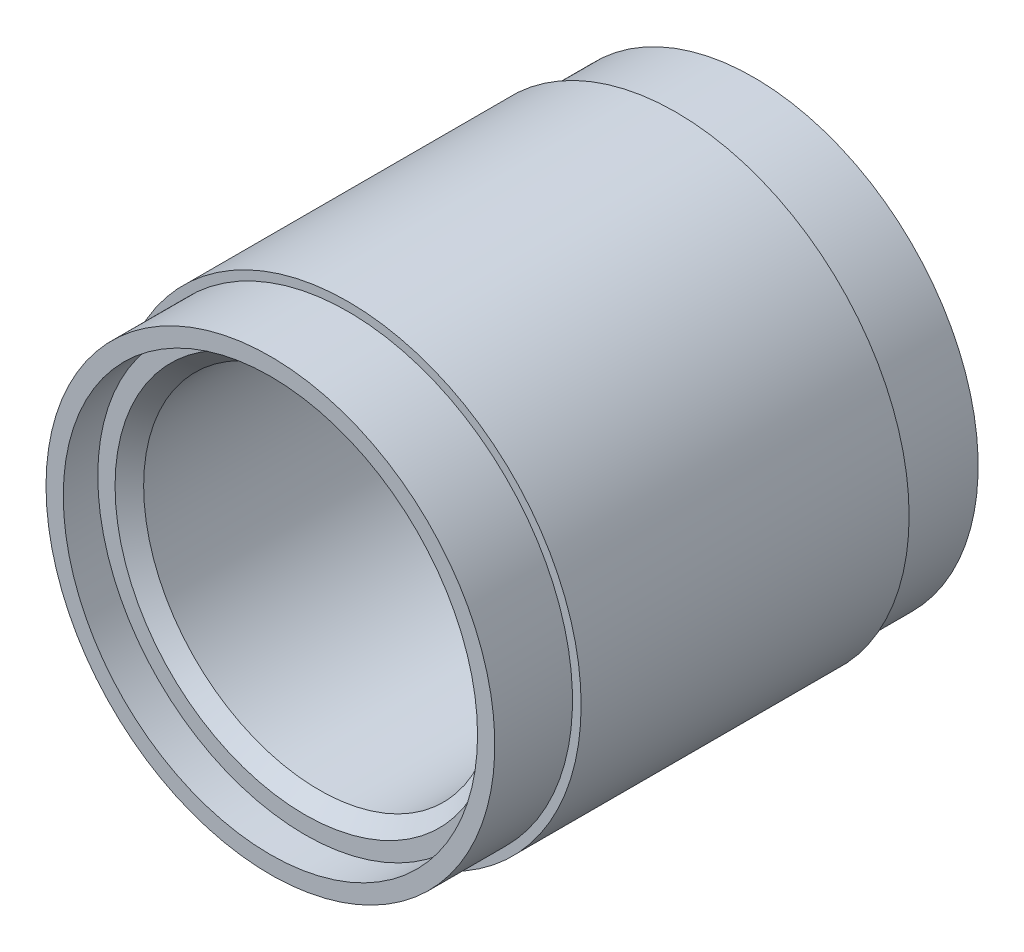
ISO-10303-21;
HEADER;
FILE_DESCRIPTION(('STEP AP214'),'2;1');
FILE_NAME('part.step','',(''),(''),'','','');
FILE_SCHEMA(('AUTOMOTIVE_DESIGN { 1 0 10303 214 1 1 1 1 }'));
ENDSEC;
DATA;
#1=APPLICATION_CONTEXT('core data for automotive mechanical design processes');
#2=APPLICATION_PROTOCOL_DEFINITION('international standard','automotive_design',2000,#1);
#3=PRODUCT_CONTEXT('',#1,'mechanical');
#4=PRODUCT('Part','Part','',(#3));
#5=PRODUCT_RELATED_PRODUCT_CATEGORY('part','',(#4));
#6=PRODUCT_DEFINITION_FORMATION('','',#4);
#7=PRODUCT_DEFINITION_CONTEXT('part definition',#1,'design');
#8=PRODUCT_DEFINITION('design','',#6,#7);
#9=PRODUCT_DEFINITION_SHAPE('','',#8);
#10=(LENGTH_UNIT() NAMED_UNIT(*) SI_UNIT(.MILLI.,.METRE.));
#11=(NAMED_UNIT(*) PLANE_ANGLE_UNIT() SI_UNIT($,.RADIAN.));
#12=(NAMED_UNIT(*) SI_UNIT($,.STERADIAN.) SOLID_ANGLE_UNIT());
#13=UNCERTAINTY_MEASURE_WITH_UNIT(LENGTH_MEASURE(1.E-05),#10,'distance_accuracy_value','');
#14=(GEOMETRIC_REPRESENTATION_CONTEXT(3) GLOBAL_UNCERTAINTY_ASSIGNED_CONTEXT((#13)) GLOBAL_UNIT_ASSIGNED_CONTEXT((#10,
#11,#12)) REPRESENTATION_CONTEXT('',''));
#15=CARTESIAN_POINT('',(0.,0.,0.));
#16=DIRECTION('',(0.,0.,1.));
#17=DIRECTION('',(1.,0.,0.));
#18=AXIS2_PLACEMENT_3D('',#15,#16,#17);
#19=CARTESIAN_POINT('',(0.,0.,4.5));
#20=DIRECTION('',(0.,0.,-0.999999999999998));
#21=DIRECTION('',(-1.,0.,0.));
#22=AXIS2_PLACEMENT_3D('',#19,#20,#21);
#23=CYLINDRICAL_SURFACE('',#22,13.);
#24=CARTESIAN_POINT('',(0.,0.,4.5));
#25=DIRECTION('',(0.,0.,0.999999999999998));
#26=DIRECTION('',(1.,0.,0.));
#27=AXIS2_PLACEMENT_3D('',#24,#25,#26);
#28=CIRCLE('',#27,13.);
#29=CARTESIAN_POINT('',(-13.,0.,4.5));
#30=VERTEX_POINT('',#29);
#31=EDGE_CURVE('E54',#30,#30,#28,.T.);
#32=CARTESIAN_POINT('',(0.,0.,0.));
#33=DIRECTION('',(0.,0.,0.999999999999998));
#34=DIRECTION('',(1.,0.,0.));
#35=AXIS2_PLACEMENT_3D('',#32,#33,#34);
#36=CIRCLE('',#35,13.);
#37=CARTESIAN_POINT('',(-13.,0.,0.));
#38=VERTEX_POINT('',#37);
#39=EDGE_CURVE('E55',#38,#38,#36,.T.);
#40=CARTESIAN_POINT('',(-13.,0.,4.5));
#41=CARTESIAN_POINT('',(-13.,0.,4.453125));
#42=CARTESIAN_POINT('',(-13.,0.,4.40625));
#43=CARTESIAN_POINT('',(-13.,0.,4.3125));
#44=CARTESIAN_POINT('',(-13.,0.,4.265625));
#45=CARTESIAN_POINT('',(-13.,0.,4.171875));
#46=CARTESIAN_POINT('',(-13.,0.,4.125));
#47=CARTESIAN_POINT('',(-13.,0.,4.03125));
#48=CARTESIAN_POINT('',(-13.,0.,3.984375));
#49=CARTESIAN_POINT('',(-13.,0.,3.890625));
#50=CARTESIAN_POINT('',(-13.,0.,3.84375));
#51=CARTESIAN_POINT('',(-13.,0.,3.75));
#52=CARTESIAN_POINT('',(-13.,0.,3.703125));
#53=CARTESIAN_POINT('',(-13.,0.,3.609375));
#54=CARTESIAN_POINT('',(-13.,0.,3.5625));
#55=CARTESIAN_POINT('',(-13.,0.,3.46875));
#56=CARTESIAN_POINT('',(-13.,0.,3.421875));
#57=CARTESIAN_POINT('',(-13.,0.,3.328125));
#58=CARTESIAN_POINT('',(-13.,0.,3.28125));
#59=CARTESIAN_POINT('',(-13.,0.,3.1875));
#60=CARTESIAN_POINT('',(-13.,0.,3.140625));
#61=CARTESIAN_POINT('',(-13.,0.,3.046875));
#62=CARTESIAN_POINT('',(-13.,0.,3.));
#63=CARTESIAN_POINT('',(-13.,0.,2.90625));
#64=CARTESIAN_POINT('',(-13.,0.,2.859375));
#65=CARTESIAN_POINT('',(-13.,0.,2.765625));
#66=CARTESIAN_POINT('',(-13.,0.,2.71875));
#67=CARTESIAN_POINT('',(-13.,0.,2.625));
#68=CARTESIAN_POINT('',(-13.,0.,2.578125));
#69=CARTESIAN_POINT('',(-13.,0.,2.484375));
#70=CARTESIAN_POINT('',(-13.,0.,2.4375));
#71=CARTESIAN_POINT('',(-13.,0.,2.34375));
#72=CARTESIAN_POINT('',(-13.,0.,2.296875));
#73=CARTESIAN_POINT('',(-13.,0.,2.203125));
#74=CARTESIAN_POINT('',(-13.,0.,2.15625));
#75=CARTESIAN_POINT('',(-13.,0.,2.0625));
#76=CARTESIAN_POINT('',(-13.,0.,2.015625));
#77=CARTESIAN_POINT('',(-13.,0.,1.921875));
#78=CARTESIAN_POINT('',(-13.,0.,1.875));
#79=CARTESIAN_POINT('',(-13.,0.,1.78125));
#80=CARTESIAN_POINT('',(-13.,0.,1.734375));
#81=CARTESIAN_POINT('',(-13.,0.,1.640625));
#82=CARTESIAN_POINT('',(-13.,0.,1.59375));
#83=CARTESIAN_POINT('',(-13.,0.,1.5));
#84=CARTESIAN_POINT('',(-13.,0.,1.453125));
#85=CARTESIAN_POINT('',(-13.,0.,1.359375));
#86=CARTESIAN_POINT('',(-13.,0.,1.3125));
#87=CARTESIAN_POINT('',(-13.,0.,1.21875));
#88=CARTESIAN_POINT('',(-13.,0.,1.171875));
#89=CARTESIAN_POINT('',(-13.,0.,1.078125));
#90=CARTESIAN_POINT('',(-13.,0.,1.03125));
#91=CARTESIAN_POINT('',(-13.,0.,0.937500000000001));
#92=CARTESIAN_POINT('',(-13.,0.,0.890625000000001));
#93=CARTESIAN_POINT('',(-13.,0.,0.796875000000001));
#94=CARTESIAN_POINT('',(-13.,0.,0.750000000000001));
#95=CARTESIAN_POINT('',(-13.,0.,0.65625));
#96=CARTESIAN_POINT('',(-13.,0.,0.609375));
#97=CARTESIAN_POINT('',(-13.,0.,0.515625));
#98=CARTESIAN_POINT('',(-13.,0.,0.46875));
#99=CARTESIAN_POINT('',(-13.,0.,0.375));
#100=CARTESIAN_POINT('',(-13.,0.,0.328125));
#101=CARTESIAN_POINT('',(-13.,0.,0.234375));
#102=CARTESIAN_POINT('',(-13.,0.,0.1875));
#103=CARTESIAN_POINT('',(-13.,0.,0.0937500000000001));
#104=CARTESIAN_POINT('',(-13.,0.,0.046875));
#105=CARTESIAN_POINT('',(-13.,0.,0.));
#106=B_SPLINE_CURVE_WITH_KNOTS('',3,(#40,#41,#42,#43,#44,#45,#46,#47,#48,#49,#50,#51,#52,#53,
#54,#55,#56,#57,#58,#59,#60,#61,#62,#63,#64,#65,#66,#67,#68,#69,#70,#71,#72,#73,#74,#75,#76,#77,
#78,#79,#80,#81,#82,#83,#84,#85,#86,#87,#88,#89,#90,#91,#92,#93,#94,#95,#96,#97,#98,#99,#100,
#101,#102,#103,#104,#105),.UNSPECIFIED.,.F.,.F.,(4,2,2,2,2,2,2,2,2,2,2,2,2,2,2,2,2,2,2,2,2,2,2,
2,2,2,2,2,2,2,2,2,4),(0.,0.140624999999999,0.281249999999999,0.421875,0.5625,0.703125,0.84375,
0.984375,1.125,1.265625,1.40625,1.546875,1.6875,1.828125,1.96875,2.109375,2.25,2.390625,2.53125,
2.671875,2.8125,2.953125,3.09375,3.234375,3.375,3.515625,3.65625,3.796875,3.9375,4.078125,
4.21875,4.359375,4.5),.UNSPECIFIED.);
#107=EDGE_CURVE('BSEAM34',#30,#38,#106,.T.);
#108=ORIENTED_EDGE('',*,*,#31,.F.);
#109=ORIENTED_EDGE('',*,*,#39,.T.);
#110=ORIENTED_EDGE('',*,*,#107,.T.);
#111=ORIENTED_EDGE('',*,*,#107,.F.);
#112=EDGE_LOOP('',(#108,#110,#109,#111));
#113=FACE_BOUND('',#112,.T.);
#114=ADVANCED_FACE('F34',(#113),#23,.T.);
#115=CARTESIAN_POINT('',(0.,0.,0.));
#116=DIRECTION('',(0.,0.,0.999999999999998));
#117=DIRECTION('',(1.,0.,0.));
#118=AXIS2_PLACEMENT_3D('',#115,#116,#117);
#119=PLANE('',#118);
#120=CARTESIAN_POINT('',(0.,0.,0.));
#121=DIRECTION('',(0.,0.,-0.999999999999998));
#122=DIRECTION('',(-1.,0.,0.));
#123=AXIS2_PLACEMENT_3D('',#120,#121,#122);
#124=CIRCLE('',#123,12.);
#125=CARTESIAN_POINT('',(-12.,0.,0.));
#126=VERTEX_POINT('',#125);
#127=EDGE_CURVE('E64',#126,#126,#124,.T.);
#128=ORIENTED_EDGE('',*,*,#127,.F.);
#129=EDGE_LOOP('',(#128));
#130=FACE_BOUND('',#129,.T.);
#131=ORIENTED_EDGE('',*,*,#39,.F.);
#132=EDGE_LOOP('',(#131));
#133=FACE_BOUND('',#132,.T.);
#134=ADVANCED_FACE('F102',(#130,#133),#119,.F.);
#135=CARTESIAN_POINT('',(0.,0.,4.5));
#136=DIRECTION('',(0.,0.,0.999999999999998));
#137=DIRECTION('',(1.,0.,0.));
#138=AXIS2_PLACEMENT_3D('',#135,#136,#137);
#139=PLANE('',#138);
#140=CARTESIAN_POINT('',(0.,0.,4.5));
#141=DIRECTION('',(0.,0.,0.999999999999998));
#142=DIRECTION('',(1.,0.,0.));
#143=AXIS2_PLACEMENT_3D('',#140,#141,#142);
#144=CIRCLE('',#143,13.5);
#145=CARTESIAN_POINT('',(-13.5,0.,4.5));
#146=VERTEX_POINT('',#145);
#147=EDGE_CURVE('E58',#146,#146,#144,.T.);
#148=ORIENTED_EDGE('',*,*,#147,.F.);
#149=EDGE_LOOP('',(#148));
#150=FACE_BOUND('',#149,.T.);
#151=ORIENTED_EDGE('',*,*,#31,.T.);
#152=EDGE_LOOP('',(#151));
#153=FACE_BOUND('',#152,.T.);
#154=ADVANCED_FACE('F108',(#150,#153),#139,.F.);
#155=CARTESIAN_POINT('',(0.,0.,14.));
#156=DIRECTION('',(0.,0.,-0.999999999999998));
#157=DIRECTION('',(-1.,0.,0.));
#158=AXIS2_PLACEMENT_3D('',#155,#156,#157);
#159=CYLINDRICAL_SURFACE('',#158,13.5);
#160=CARTESIAN_POINT('',(0.,0.,23.5));
#161=DIRECTION('',(0.,0.,0.999999999999998));
#162=DIRECTION('',(1.,0.,0.));
#163=AXIS2_PLACEMENT_3D('',#160,#161,#162);
#164=CIRCLE('',#163,13.5);
#165=CARTESIAN_POINT('',(-13.5,0.,23.5));
#166=VERTEX_POINT('',#165);
#167=EDGE_CURVE('E73',#166,#166,#164,.T.);
#168=CARTESIAN_POINT('',(-13.5,0.,4.5));
#169=CARTESIAN_POINT('',(-13.5,0.,4.69791666666667));
#170=CARTESIAN_POINT('',(-13.5,0.,4.89583333333333));
#171=CARTESIAN_POINT('',(-13.5,0.,5.29166666666667));
#172=CARTESIAN_POINT('',(-13.5,0.,5.48958333333333));
#173=CARTESIAN_POINT('',(-13.5,0.,5.88541666666666));
#174=CARTESIAN_POINT('',(-13.5,0.,6.08333333333333));
#175=CARTESIAN_POINT('',(-13.5,0.,6.47916666666666));
#176=CARTESIAN_POINT('',(-13.5,0.,6.67708333333333));
#177=CARTESIAN_POINT('',(-13.5,0.,7.07291666666666));
#178=CARTESIAN_POINT('',(-13.5,0.,7.27083333333333));
#179=CARTESIAN_POINT('',(-13.5,0.,7.66666666666666));
#180=CARTESIAN_POINT('',(-13.5,0.,7.86458333333333));
#181=CARTESIAN_POINT('',(-13.5,0.,8.26041666666666));
#182=CARTESIAN_POINT('',(-13.5,0.,8.45833333333333));
#183=CARTESIAN_POINT('',(-13.5,0.,8.85416666666666));
#184=CARTESIAN_POINT('',(-13.5,0.,9.05208333333333));
#185=CARTESIAN_POINT('',(-13.5,0.,9.44791666666666));
#186=CARTESIAN_POINT('',(-13.5,0.,9.64583333333332));
#187=CARTESIAN_POINT('',(-13.5,0.,10.0416666666667));
#188=CARTESIAN_POINT('',(-13.5,0.,10.2395833333333));
#189=CARTESIAN_POINT('',(-13.5,0.,10.6354166666667));
#190=CARTESIAN_POINT('',(-13.5,0.,10.8333333333333));
#191=CARTESIAN_POINT('',(-13.5,0.,11.2291666666667));
#192=CARTESIAN_POINT('',(-13.5,0.,11.4270833333333));
#193=CARTESIAN_POINT('',(-13.5,0.,11.8229166666667));
#194=CARTESIAN_POINT('',(-13.5,0.,12.0208333333333));
#195=CARTESIAN_POINT('',(-13.5,0.,12.4166666666666));
#196=CARTESIAN_POINT('',(-13.5,0.,12.6145833333333));
#197=CARTESIAN_POINT('',(-13.5,0.,13.0104166666667));
#198=CARTESIAN_POINT('',(-13.5,0.,13.2083333333333));
#199=CARTESIAN_POINT('',(-13.5,0.,13.6041666666666));
#200=CARTESIAN_POINT('',(-13.5,0.,13.8020833333333));
#201=CARTESIAN_POINT('',(-13.5,0.,14.1979166666666));
#202=CARTESIAN_POINT('',(-13.5,0.,14.3958333333333));
#203=CARTESIAN_POINT('',(-13.5,0.,14.7916666666666));
#204=CARTESIAN_POINT('',(-13.5,0.,14.9895833333333));
#205=CARTESIAN_POINT('',(-13.5,0.,15.3854166666666));
#206=CARTESIAN_POINT('',(-13.5,0.,15.5833333333333));
#207=CARTESIAN_POINT('',(-13.5,0.,15.9791666666666));
#208=CARTESIAN_POINT('',(-13.5,0.,16.1770833333333));
#209=CARTESIAN_POINT('',(-13.5,0.,16.5729166666666));
#210=CARTESIAN_POINT('',(-13.5,0.,16.7708333333333));
#211=CARTESIAN_POINT('',(-13.5,0.,17.1666666666666));
#212=CARTESIAN_POINT('',(-13.5,0.,17.3645833333333));
#213=CARTESIAN_POINT('',(-13.5,0.,17.7604166666666));
#214=CARTESIAN_POINT('',(-13.5,0.,17.9583333333333));
#215=CARTESIAN_POINT('',(-13.5,0.,18.3541666666666));
#216=CARTESIAN_POINT('',(-13.5,0.,18.5520833333333));
#217=CARTESIAN_POINT('',(-13.5,0.,18.9479166666666));
#218=CARTESIAN_POINT('',(-13.5,0.,19.1458333333333));
#219=CARTESIAN_POINT('',(-13.5,0.,19.5416666666666));
#220=CARTESIAN_POINT('',(-13.5,0.,19.7395833333333));
#221=CARTESIAN_POINT('',(-13.5,0.,20.1354166666666));
#222=CARTESIAN_POINT('',(-13.5,0.,20.3333333333333));
#223=CARTESIAN_POINT('',(-13.5,0.,20.7291666666666));
#224=CARTESIAN_POINT('',(-13.5,0.,20.9270833333333));
#225=CARTESIAN_POINT('',(-13.5,0.,21.3229166666666));
#226=CARTESIAN_POINT('',(-13.5,0.,21.5208333333333));
#227=CARTESIAN_POINT('',(-13.5,0.,21.9166666666666));
#228=CARTESIAN_POINT('',(-13.5,0.,22.1145833333333));
#229=CARTESIAN_POINT('',(-13.5,0.,22.5104166666666));
#230=CARTESIAN_POINT('',(-13.5,0.,22.7083333333333));
#231=CARTESIAN_POINT('',(-13.5,0.,23.1041666666666));
#232=CARTESIAN_POINT('',(-13.5,0.,23.3020833333333));
#233=CARTESIAN_POINT('',(-13.5,0.,23.5));
#234=B_SPLINE_CURVE_WITH_KNOTS('',3,(#168,#169,#170,#171,#172,#173,#174,#175,#176,#177,#178,
#179,#180,#181,#182,#183,#184,#185,#186,#187,#188,#189,#190,#191,#192,#193,#194,#195,#196,#197,
#198,#199,#200,#201,#202,#203,#204,#205,#206,#207,#208,#209,#210,#211,#212,#213,#214,#215,#216,
#217,#218,#219,#220,#221,#222,#223,#224,#225,#226,#227,#228,#229,#230,#231,#232,#233),
.UNSPECIFIED.,.F.,.F.,(4,2,2,2,2,2,2,2,2,2,2,2,2,2,2,2,2,2,2,2,2,2,2,2,2,2,2,2,2,2,2,2,4),(0.,
0.593749999999997,1.1875,1.78124999999999,2.37499999999999,2.96874999999999,3.56249999999999,
4.15624999999999,4.74999999999999,5.34374999999999,5.93749999999999,6.53124999999998,
7.12499999999998,7.71874999999998,8.31249999999998,8.90624999999998,9.49999999999998,10.09375,
10.6875,11.28125,11.875,12.46875,13.0625,13.65625,14.25,14.84375,15.4375,16.03125,16.625,
17.21875,17.8125,18.40625,19.),.UNSPECIFIED.);
#235=EDGE_CURVE('BSEAM198',#146,#166,#234,.T.);
#236=ORIENTED_EDGE('',*,*,#147,.T.);
#237=ORIENTED_EDGE('',*,*,#167,.F.);
#238=ORIENTED_EDGE('',*,*,#235,.T.);
#239=ORIENTED_EDGE('',*,*,#235,.F.);
#240=EDGE_LOOP('',(#236,#238,#237,#239));
#241=FACE_BOUND('',#240,.T.);
#242=ADVANCED_FACE('F198',(#241),#159,.T.);
#243=CARTESIAN_POINT('',(0.,0.,2.));
#244=DIRECTION('',(0.,0.,-0.999999999999998));
#245=DIRECTION('',(-1.,0.,0.));
#246=AXIS2_PLACEMENT_3D('',#243,#244,#245);
#247=CYLINDRICAL_SURFACE('',#246,12.);
#248=CARTESIAN_POINT('',(0.,0.,2.));
#249=DIRECTION('',(0.,0.,-0.999999999999998));
#250=DIRECTION('',(-1.,0.,0.));
#251=AXIS2_PLACEMENT_3D('',#248,#249,#250);
#252=CIRCLE('',#251,12.);
#253=CARTESIAN_POINT('',(-12.,0.,2.));
#254=VERTEX_POINT('',#253);
#255=EDGE_CURVE('E63',#254,#254,#252,.T.);
#256=CARTESIAN_POINT('',(-12.,0.,2.));
#257=CARTESIAN_POINT('',(-12.,0.,1.97916666666667));
#258=CARTESIAN_POINT('',(-12.,0.,1.95833333333334));
#259=CARTESIAN_POINT('',(-12.,0.,1.91666666666667));
#260=CARTESIAN_POINT('',(-12.,0.,1.89583333333334));
#261=CARTESIAN_POINT('',(-12.,0.,1.85416666666667));
#262=CARTESIAN_POINT('',(-12.,0.,1.83333333333334));
#263=CARTESIAN_POINT('',(-12.,0.,1.79166666666667));
#264=CARTESIAN_POINT('',(-12.,0.,1.77083333333334));
#265=CARTESIAN_POINT('',(-12.,0.,1.72916666666667));
#266=CARTESIAN_POINT('',(-12.,0.,1.70833333333334));
#267=CARTESIAN_POINT('',(-12.,0.,1.66666666666667));
#268=CARTESIAN_POINT('',(-12.,0.,1.64583333333334));
#269=CARTESIAN_POINT('',(-12.,0.,1.60416666666667));
#270=CARTESIAN_POINT('',(-12.,0.,1.58333333333334));
#271=CARTESIAN_POINT('',(-12.,0.,1.54166666666667));
#272=CARTESIAN_POINT('',(-12.,0.,1.52083333333334));
#273=CARTESIAN_POINT('',(-12.,0.,1.47916666666667));
#274=CARTESIAN_POINT('',(-12.,0.,1.45833333333334));
#275=CARTESIAN_POINT('',(-12.,0.,1.41666666666667));
#276=CARTESIAN_POINT('',(-12.,0.,1.39583333333334));
#277=CARTESIAN_POINT('',(-12.,0.,1.35416666666667));
#278=CARTESIAN_POINT('',(-12.,0.,1.33333333333334));
#279=CARTESIAN_POINT('',(-12.,0.,1.29166666666667));
#280=CARTESIAN_POINT('',(-12.,0.,1.27083333333334));
#281=CARTESIAN_POINT('',(-12.,0.,1.22916666666667));
#282=CARTESIAN_POINT('',(-12.,0.,1.20833333333333));
#283=CARTESIAN_POINT('',(-12.,0.,1.16666666666667));
#284=CARTESIAN_POINT('',(-12.,0.,1.14583333333333));
#285=CARTESIAN_POINT('',(-12.,0.,1.10416666666667));
#286=CARTESIAN_POINT('',(-12.,0.,1.08333333333333));
#287=CARTESIAN_POINT('',(-12.,0.,1.04166666666667));
#288=CARTESIAN_POINT('',(-12.,0.,1.02083333333333));
#289=CARTESIAN_POINT('',(-12.,0.,0.979166666666668));
#290=CARTESIAN_POINT('',(-12.,0.,0.958333333333335));
#291=CARTESIAN_POINT('',(-12.,0.,0.916666666666668));
#292=CARTESIAN_POINT('',(-12.,0.,0.895833333333335));
#293=CARTESIAN_POINT('',(-12.,0.,0.854166666666668));
#294=CARTESIAN_POINT('',(-12.,0.,0.833333333333335));
#295=CARTESIAN_POINT('',(-12.,0.,0.791666666666668));
#296=CARTESIAN_POINT('',(-12.,0.,0.770833333333334));
#297=CARTESIAN_POINT('',(-12.,0.,0.729166666666668));
#298=CARTESIAN_POINT('',(-12.,0.,0.708333333333334));
#299=CARTESIAN_POINT('',(-12.,0.,0.666666666666668));
#300=CARTESIAN_POINT('',(-12.,0.,0.645833333333334));
#301=CARTESIAN_POINT('',(-12.,0.,0.604166666666668));
#302=CARTESIAN_POINT('',(-12.,0.,0.583333333333334));
#303=CARTESIAN_POINT('',(-12.,0.,0.541666666666668));
#304=CARTESIAN_POINT('',(-12.,0.,0.520833333333334));
#305=CARTESIAN_POINT('',(-12.,0.,0.479166666666668));
#306=CARTESIAN_POINT('',(-12.,0.,0.458333333333334));
#307=CARTESIAN_POINT('',(-12.,0.,0.416666666666668));
#308=CARTESIAN_POINT('',(-12.,0.,0.395833333333334));
#309=CARTESIAN_POINT('',(-12.,0.,0.354166666666668));
#310=CARTESIAN_POINT('',(-12.,0.,0.333333333333334));
#311=CARTESIAN_POINT('',(-12.,0.,0.291666666666668));
#312=CARTESIAN_POINT('',(-12.,0.,0.270833333333334));
#313=CARTESIAN_POINT('',(-12.,0.,0.229166666666668));
#314=CARTESIAN_POINT('',(-12.,0.,0.208333333333334));
#315=CARTESIAN_POINT('',(-12.,0.,0.166666666666667));
#316=CARTESIAN_POINT('',(-12.,0.,0.145833333333334));
#317=CARTESIAN_POINT('',(-12.,0.,0.104166666666667));
#318=CARTESIAN_POINT('',(-12.,0.,0.0833333333333341));
#319=CARTESIAN_POINT('',(-12.,0.,0.0416666666666673));
#320=CARTESIAN_POINT('',(-12.,0.,0.0208333333333339));
#321=CARTESIAN_POINT('',(-12.,0.,0.));
#322=B_SPLINE_CURVE_WITH_KNOTS('',3,(#256,#257,#258,#259,#260,#261,#262,#263,#264,#265,#266,
#267,#268,#269,#270,#271,#272,#273,#274,#275,#276,#277,#278,#279,#280,#281,#282,#283,#284,#285,
#286,#287,#288,#289,#290,#291,#292,#293,#294,#295,#296,#297,#298,#299,#300,#301,#302,#303,#304,
#305,#306,#307,#308,#309,#310,#311,#312,#313,#314,#315,#316,#317,#318,#319,#320,#321),
.UNSPECIFIED.,.F.,.F.,(4,2,2,2,2,2,2,2,2,2,2,2,2,2,2,2,2,2,2,2,2,2,2,2,2,2,2,2,2,2,2,2,4),(0.,
0.0624999999999998,0.125,0.1875,0.25,0.3125,0.375,0.4375,0.5,0.5625,0.625,0.6875,0.75,0.8125,
0.875,0.9375,1.,1.0625,1.125,1.1875,1.25,1.3125,1.375,1.4375,1.5,1.5625,1.625,1.6875,1.75,
1.8125,1.875,1.9375,2.),.UNSPECIFIED.);
#323=EDGE_CURVE('BSEAM188',#254,#126,#322,.T.);
#324=ORIENTED_EDGE('',*,*,#255,.F.);
#325=ORIENTED_EDGE('',*,*,#127,.T.);
#326=ORIENTED_EDGE('',*,*,#323,.T.);
#327=ORIENTED_EDGE('',*,*,#323,.F.);
#328=EDGE_LOOP('',(#324,#326,#325,#327));
#329=FACE_BOUND('',#328,.T.);
#330=ADVANCED_FACE('F188',(#329),#247,.F.);
#331=CARTESIAN_POINT('',(0.,0.,2.));
#332=DIRECTION('',(0.,0.,-0.999999999999998));
#333=DIRECTION('',(-1.,0.,0.));
#334=AXIS2_PLACEMENT_3D('',#331,#332,#333);
#335=PLANE('',#334);
#336=CARTESIAN_POINT('',(0.,0.,2.));
#337=DIRECTION('',(0.,0.,-0.999999999999998));
#338=DIRECTION('',(-1.,0.,0.));
#339=AXIS2_PLACEMENT_3D('',#336,#337,#338);
#340=CIRCLE('',#339,11.);
#341=CARTESIAN_POINT('',(-11.,0.,2.));
#342=VERTEX_POINT('',#341);
#343=EDGE_CURVE('E10',#342,#342,#340,.F.);
#344=ORIENTED_EDGE('',*,*,#343,.T.);
#345=EDGE_LOOP('',(#344));
#346=FACE_BOUND('',#345,.T.);
#347=ORIENTED_EDGE('',*,*,#255,.T.);
#348=EDGE_LOOP('',(#347));
#349=FACE_BOUND('',#348,.T.);
#350=ADVANCED_FACE('F177',(#346,#349),#335,.T.);
#351=CARTESIAN_POINT('',(0.,0.,23.5));
#352=DIRECTION('',(0.,0.,0.999999999999998));
#353=DIRECTION('',(-1.,0.,0.));
#354=AXIS2_PLACEMENT_3D('',#351,#352,#353);
#355=CYLINDRICAL_SURFACE('',#354,13.);
#356=CARTESIAN_POINT('',(0.,0.,23.5));
#357=DIRECTION('',(0.,0.,0.999999999999998));
#358=DIRECTION('',(1.,0.,0.));
#359=AXIS2_PLACEMENT_3D('',#356,#357,#358);
#360=CIRCLE('',#359,13.);
#361=CARTESIAN_POINT('',(-13.,0.,23.5));
#362=VERTEX_POINT('',#361);
#363=EDGE_CURVE('E67',#362,#362,#360,.T.);
#364=CARTESIAN_POINT('',(0.,0.,27.9999999999999));
#365=DIRECTION('',(0.,0.,0.999999999999998));
#366=DIRECTION('',(1.,0.,0.));
#367=AXIS2_PLACEMENT_3D('',#364,#365,#366);
#368=CIRCLE('',#367,13.);
#369=CARTESIAN_POINT('',(-13.,0.,28.));
#370=VERTEX_POINT('',#369);
#371=EDGE_CURVE('E70',#370,#370,#368,.T.);
#372=CARTESIAN_POINT('',(-13.,0.,23.5));
#373=CARTESIAN_POINT('',(-13.,0.,23.546875));
#374=CARTESIAN_POINT('',(-13.,0.,23.59375));
#375=CARTESIAN_POINT('',(-13.,0.,23.6875));
#376=CARTESIAN_POINT('',(-13.,0.,23.734375));
#377=CARTESIAN_POINT('',(-13.,0.,23.828125));
#378=CARTESIAN_POINT('',(-13.,0.,23.875));
#379=CARTESIAN_POINT('',(-13.,0.,23.96875));
#380=CARTESIAN_POINT('',(-13.,0.,24.015625));
#381=CARTESIAN_POINT('',(-13.,0.,24.109375));
#382=CARTESIAN_POINT('',(-13.,0.,24.15625));
#383=CARTESIAN_POINT('',(-13.,0.,24.25));
#384=CARTESIAN_POINT('',(-13.,0.,24.296875));
#385=CARTESIAN_POINT('',(-13.,0.,24.390625));
#386=CARTESIAN_POINT('',(-13.,0.,24.4375));
#387=CARTESIAN_POINT('',(-13.,0.,24.53125));
#388=CARTESIAN_POINT('',(-13.,0.,24.578125));
#389=CARTESIAN_POINT('',(-13.,0.,24.671875));
#390=CARTESIAN_POINT('',(-13.,0.,24.71875));
#391=CARTESIAN_POINT('',(-13.,0.,24.8125));
#392=CARTESIAN_POINT('',(-13.,0.,24.859375));
#393=CARTESIAN_POINT('',(-13.,0.,24.953125));
#394=CARTESIAN_POINT('',(-13.,0.,25.));
#395=CARTESIAN_POINT('',(-13.,0.,25.09375));
#396=CARTESIAN_POINT('',(-13.,0.,25.140625));
#397=CARTESIAN_POINT('',(-13.,0.,25.234375));
#398=CARTESIAN_POINT('',(-13.,0.,25.28125));
#399=CARTESIAN_POINT('',(-13.,0.,25.375));
#400=CARTESIAN_POINT('',(-13.,0.,25.421875));
#401=CARTESIAN_POINT('',(-13.,0.,25.515625));
#402=CARTESIAN_POINT('',(-13.,0.,25.5625));
#403=CARTESIAN_POINT('',(-13.,0.,25.65625));
#404=CARTESIAN_POINT('',(-13.,0.,25.703125));
#405=CARTESIAN_POINT('',(-13.,0.,25.796875));
#406=CARTESIAN_POINT('',(-13.,0.,25.84375));
#407=CARTESIAN_POINT('',(-13.,0.,25.9375));
#408=CARTESIAN_POINT('',(-13.,0.,25.984375));
#409=CARTESIAN_POINT('',(-13.,0.,26.078125));
#410=CARTESIAN_POINT('',(-13.,0.,26.125));
#411=CARTESIAN_POINT('',(-13.,0.,26.21875));
#412=CARTESIAN_POINT('',(-13.,0.,26.265625));
#413=CARTESIAN_POINT('',(-13.,0.,26.359375));
#414=CARTESIAN_POINT('',(-13.,0.,26.40625));
#415=CARTESIAN_POINT('',(-13.,0.,26.5));
#416=CARTESIAN_POINT('',(-13.,0.,26.546875));
#417=CARTESIAN_POINT('',(-13.,0.,26.640625));
#418=CARTESIAN_POINT('',(-13.,0.,26.6875));
#419=CARTESIAN_POINT('',(-13.,0.,26.7812499999999));
#420=CARTESIAN_POINT('',(-13.,0.,26.828125));
#421=CARTESIAN_POINT('',(-13.,0.,26.921875));
#422=CARTESIAN_POINT('',(-13.,0.,26.9687499999999));
#423=CARTESIAN_POINT('',(-13.,0.,27.0624999999999));
#424=CARTESIAN_POINT('',(-13.,0.,27.109375));
#425=CARTESIAN_POINT('',(-13.,0.,27.203125));
#426=CARTESIAN_POINT('',(-13.,0.,27.2499999999999));
#427=CARTESIAN_POINT('',(-13.,0.,27.3437499999999));
#428=CARTESIAN_POINT('',(-13.,0.,27.390625));
#429=CARTESIAN_POINT('',(-13.,0.,27.4843749999999));
#430=CARTESIAN_POINT('',(-13.,0.,27.5312499999999));
#431=CARTESIAN_POINT('',(-13.,0.,27.6249999999999));
#432=CARTESIAN_POINT('',(-13.,0.,27.6718749999999));
#433=CARTESIAN_POINT('',(-13.,0.,27.7656249999999));
#434=CARTESIAN_POINT('',(-13.,0.,27.8124999999999));
#435=CARTESIAN_POINT('',(-13.,0.,27.9062499999999));
#436=CARTESIAN_POINT('',(-13.,0.,27.9531249999999));
#437=CARTESIAN_POINT('',(-13.,0.,28.));
#438=B_SPLINE_CURVE_WITH_KNOTS('',3,(#372,#373,#374,#375,#376,#377,#378,#379,#380,#381,#382,
#383,#384,#385,#386,#387,#388,#389,#390,#391,#392,#393,#394,#395,#396,#397,#398,#399,#400,#401,
#402,#403,#404,#405,#406,#407,#408,#409,#410,#411,#412,#413,#414,#415,#416,#417,#418,#419,#420,
#421,#422,#423,#424,#425,#426,#427,#428,#429,#430,#431,#432,#433,#434,#435,#436,#437),
.UNSPECIFIED.,.F.,.F.,(4,2,2,2,2,2,2,2,2,2,2,2,2,2,2,2,2,2,2,2,2,2,2,2,2,2,2,2,2,2,2,2,4),(0.,
0.140624999999998,0.281249999999997,0.421874999999999,0.562499999999997,0.703124999999995,
0.843749999999997,0.984374999999996,1.12499999999999,1.265625,1.40624999999999,1.546875,
1.68749999999999,1.82812499999999,1.96874999999999,2.10937499999999,2.25,2.39062499999999,
2.53124999999999,2.67187499999999,2.81249999999999,2.95312499999999,3.09374999999999,
3.23437499999999,3.37499999999999,3.51562499999999,3.65624999999999,3.79687499999999,
3.93749999999999,4.07812499999999,4.21874999999999,4.35937499999999,4.49999999999999),.UNSPECIFIED.);
#439=EDGE_CURVE('BSEAM167',#362,#370,#438,.T.);
#440=ORIENTED_EDGE('',*,*,#363,.T.);
#441=ORIENTED_EDGE('',*,*,#371,.F.);
#442=ORIENTED_EDGE('',*,*,#439,.T.);
#443=ORIENTED_EDGE('',*,*,#439,.F.);
#444=EDGE_LOOP('',(#440,#442,#441,#443));
#445=FACE_BOUND('',#444,.T.);
#446=ADVANCED_FACE('F167',(#445),#355,.T.);
#447=CARTESIAN_POINT('',(0.,0.,27.9999999999999));
#448=DIRECTION('',(0.,0.,-0.999999999999998));
#449=DIRECTION('',(1.,0.,0.));
#450=AXIS2_PLACEMENT_3D('',#447,#448,#449);
#451=PLANE('',#450);
#452=CARTESIAN_POINT('',(0.,0.,27.9999999999999));
#453=DIRECTION('',(0.,0.,-0.999999999999998));
#454=DIRECTION('',(-1.,0.,0.));
#455=AXIS2_PLACEMENT_3D('',#452,#453,#454);
#456=CIRCLE('',#455,12.);
#457=CARTESIAN_POINT('',(-12.,0.,27.9999999999999));
#458=VERTEX_POINT('',#457);
#459=EDGE_CURVE('E79',#458,#458,#456,.T.);
#460=ORIENTED_EDGE('',*,*,#459,.T.);
#461=EDGE_LOOP('',(#460));
#462=FACE_BOUND('',#461,.T.);
#463=ORIENTED_EDGE('',*,*,#371,.T.);
#464=EDGE_LOOP('',(#463));
#465=FACE_BOUND('',#464,.T.);
#466=ADVANCED_FACE('F157',(#462,#465),#451,.F.);
#467=CARTESIAN_POINT('',(0.,0.,23.5));
#468=DIRECTION('',(0.,0.,-0.999999999999998));
#469=DIRECTION('',(1.,0.,0.));
#470=AXIS2_PLACEMENT_3D('',#467,#468,#469);
#471=PLANE('',#470);
#472=ORIENTED_EDGE('',*,*,#167,.T.);
#473=EDGE_LOOP('',(#472));
#474=FACE_BOUND('',#473,.T.);
#475=ORIENTED_EDGE('',*,*,#363,.F.);
#476=EDGE_LOOP('',(#475));
#477=FACE_BOUND('',#476,.T.);
#478=ADVANCED_FACE('F99',(#474,#477),#471,.F.);
#479=CARTESIAN_POINT('',(0.,0.,25.9999999999999));
#480=DIRECTION('',(0.,0.,0.999999999999998));
#481=DIRECTION('',(-1.,0.,0.));
#482=AXIS2_PLACEMENT_3D('',#479,#480,#481);
#483=CYLINDRICAL_SURFACE('',#482,12.);
#484=CARTESIAN_POINT('',(0.,0.,25.9999999999999));
#485=DIRECTION('',(0.,0.,-0.999999999999998));
#486=DIRECTION('',(-1.,0.,0.));
#487=AXIS2_PLACEMENT_3D('',#484,#485,#486);
#488=CIRCLE('',#487,12.);
#489=CARTESIAN_POINT('',(-12.,0.,25.9999999999999));
#490=VERTEX_POINT('',#489);
#491=EDGE_CURVE('E78',#490,#490,#488,.T.);
#492=CARTESIAN_POINT('',(-12.,0.,25.9999999999999));
#493=CARTESIAN_POINT('',(-12.,0.,26.0208333333333));
#494=CARTESIAN_POINT('',(-12.,0.,26.0416666666666));
#495=CARTESIAN_POINT('',(-12.,0.,26.0833333333333));
#496=CARTESIAN_POINT('',(-12.,0.,26.1041666666666));
#497=CARTESIAN_POINT('',(-12.,0.,26.1458333333333));
#498=CARTESIAN_POINT('',(-12.,0.,26.1666666666666));
#499=CARTESIAN_POINT('',(-12.,0.,26.2083333333333));
#500=CARTESIAN_POINT('',(-12.,0.,26.2291666666666));
#501=CARTESIAN_POINT('',(-12.,0.,26.2708333333333));
#502=CARTESIAN_POINT('',(-12.,0.,26.2916666666666));
#503=CARTESIAN_POINT('',(-12.,0.,26.3333333333333));
#504=CARTESIAN_POINT('',(-12.,0.,26.3541666666666));
#505=CARTESIAN_POINT('',(-12.,0.,26.3958333333333));
#506=CARTESIAN_POINT('',(-12.,0.,26.4166666666666));
#507=CARTESIAN_POINT('',(-12.,0.,26.4583333333333));
#508=CARTESIAN_POINT('',(-12.,0.,26.4791666666666));
#509=CARTESIAN_POINT('',(-12.,0.,26.5208333333333));
#510=CARTESIAN_POINT('',(-12.,0.,26.5416666666666));
#511=CARTESIAN_POINT('',(-12.,0.,26.5833333333333));
#512=CARTESIAN_POINT('',(-12.,0.,26.6041666666666));
#513=CARTESIAN_POINT('',(-12.,0.,26.6458333333333));
#514=CARTESIAN_POINT('',(-12.,0.,26.6666666666666));
#515=CARTESIAN_POINT('',(-12.,0.,26.7083333333333));
#516=CARTESIAN_POINT('',(-12.,0.,26.7291666666666));
#517=CARTESIAN_POINT('',(-12.,0.,26.7708333333333));
#518=CARTESIAN_POINT('',(-12.,0.,26.7916666666666));
#519=CARTESIAN_POINT('',(-12.,0.,26.8333333333333));
#520=CARTESIAN_POINT('',(-12.,0.,26.8541666666666));
#521=CARTESIAN_POINT('',(-12.,0.,26.8958333333333));
#522=CARTESIAN_POINT('',(-12.,0.,26.9166666666666));
#523=CARTESIAN_POINT('',(-12.,0.,26.9583333333333));
#524=CARTESIAN_POINT('',(-12.,0.,26.9791666666666));
#525=CARTESIAN_POINT('',(-12.,0.,27.0208333333333));
#526=CARTESIAN_POINT('',(-12.,0.,27.0416666666666));
#527=CARTESIAN_POINT('',(-12.,0.,27.0833333333333));
#528=CARTESIAN_POINT('',(-12.,0.,27.1041666666666));
#529=CARTESIAN_POINT('',(-12.,0.,27.1458333333333));
#530=CARTESIAN_POINT('',(-12.,0.,27.1666666666666));
#531=CARTESIAN_POINT('',(-12.,0.,27.2083333333333));
#532=CARTESIAN_POINT('',(-12.,0.,27.2291666666666));
#533=CARTESIAN_POINT('',(-12.,0.,27.2708333333333));
#534=CARTESIAN_POINT('',(-12.,0.,27.2916666666666));
#535=CARTESIAN_POINT('',(-12.,0.,27.3333333333333));
#536=CARTESIAN_POINT('',(-12.,0.,27.3541666666666));
#537=CARTESIAN_POINT('',(-12.,0.,27.3958333333333));
#538=CARTESIAN_POINT('',(-12.,0.,27.4166666666666));
#539=CARTESIAN_POINT('',(-12.,0.,27.4583333333333));
#540=CARTESIAN_POINT('',(-12.,0.,27.4791666666666));
#541=CARTESIAN_POINT('',(-12.,0.,27.5208333333333));
#542=CARTESIAN_POINT('',(-12.,0.,27.5416666666666));
#543=CARTESIAN_POINT('',(-12.,0.,27.5833333333333));
#544=CARTESIAN_POINT('',(-12.,0.,27.6041666666666));
#545=CARTESIAN_POINT('',(-12.,0.,27.6458333333333));
#546=CARTESIAN_POINT('',(-12.,0.,27.6666666666666));
#547=CARTESIAN_POINT('',(-12.,0.,27.7083333333333));
#548=CARTESIAN_POINT('',(-12.,0.,27.7291666666666));
#549=CARTESIAN_POINT('',(-12.,0.,27.7708333333333));
#550=CARTESIAN_POINT('',(-12.,0.,27.7916666666666));
#551=CARTESIAN_POINT('',(-12.,0.,27.8333333333333));
#552=CARTESIAN_POINT('',(-12.,0.,27.8541666666666));
#553=CARTESIAN_POINT('',(-12.,0.,27.8958333333333));
#554=CARTESIAN_POINT('',(-12.,0.,27.9166666666666));
#555=CARTESIAN_POINT('',(-12.,0.,27.9583333333333));
#556=CARTESIAN_POINT('',(-12.,0.,27.9791666666666));
#557=CARTESIAN_POINT('',(-12.,0.,27.9999999999999));
#558=B_SPLINE_CURVE_WITH_KNOTS('',3,(#492,#493,#494,#495,#496,#497,#498,#499,#500,#501,#502,
#503,#504,#505,#506,#507,#508,#509,#510,#511,#512,#513,#514,#515,#516,#517,#518,#519,#520,#521,
#522,#523,#524,#525,#526,#527,#528,#529,#530,#531,#532,#533,#534,#535,#536,#537,#538,#539,#540,
#541,#542,#543,#544,#545,#546,#547,#548,#549,#550,#551,#552,#553,#554,#555,#556,#557),
.UNSPECIFIED.,.F.,.F.,(4,2,2,2,2,2,2,2,2,2,2,2,2,2,2,2,2,2,2,2,2,2,2,2,2,2,2,2,2,2,2,2,4),(0.,
0.0625000000000001,0.125,0.1875,0.25,0.3125,0.375,0.4375,0.5,0.5625,0.625000000000001,
0.687500000000001,0.750000000000001,0.812500000000001,0.875000000000001,0.937500000000001,1.,
1.0625,1.125,1.1875,1.25,1.3125,1.375,1.4375,1.5,1.5625,1.625,1.6875,1.75,1.8125,1.875,1.9375,
2.),.UNSPECIFIED.);
#559=EDGE_CURVE('BSEAM85',#490,#458,#558,.T.);
#560=ORIENTED_EDGE('',*,*,#491,.T.);
#561=ORIENTED_EDGE('',*,*,#459,.F.);
#562=ORIENTED_EDGE('',*,*,#559,.T.);
#563=ORIENTED_EDGE('',*,*,#559,.F.);
#564=EDGE_LOOP('',(#560,#562,#561,#563));
#565=FACE_BOUND('',#564,.T.);
#566=ADVANCED_FACE('F85',(#565),#483,.F.);
#567=CARTESIAN_POINT('',(0.,0.,25.9999999999999));
#568=DIRECTION('',(0.,0.,0.999999999999998));
#569=DIRECTION('',(-1.,0.,0.));
#570=AXIS2_PLACEMENT_3D('',#567,#568,#569);
#571=PLANE('',#570);
#572=CARTESIAN_POINT('',(0.,0.,25.9999999999999));
#573=DIRECTION('',(0.,0.,0.999999999999998));
#574=DIRECTION('',(1.,0.,0.));
#575=AXIS2_PLACEMENT_3D('',#572,#573,#574);
#576=CIRCLE('',#575,11.);
#577=CARTESIAN_POINT('',(11.,0.,25.9999999999999));
#578=VERTEX_POINT('',#577);
#579=EDGE_CURVE('E41',#578,#578,#576,.F.);
#580=ORIENTED_EDGE('',*,*,#579,.T.);
#581=EDGE_LOOP('',(#580));
#582=FACE_BOUND('',#581,.T.);
#583=ORIENTED_EDGE('',*,*,#491,.F.);
#584=EDGE_LOOP('',(#583));
#585=FACE_BOUND('',#584,.T.);
#586=ADVANCED_FACE('F88',(#582,#585),#571,.T.);
#587=CARTESIAN_POINT('',(0.,0.,27.9999999999999));
#588=DIRECTION('',(0.,0.,-0.999999999999998));
#589=DIRECTION('',(-1.,0.,0.));
#590=AXIS2_PLACEMENT_3D('',#587,#588,#589);
#591=CYLINDRICAL_SURFACE('',#590,10.172);
#592=CARTESIAN_POINT('',(0.,0.,25.1719999999999));
#593=DIRECTION('',(0.,0.,0.999999999999998));
#594=DIRECTION('',(1.,0.,0.));
#595=AXIS2_PLACEMENT_3D('',#592,#593,#594);
#596=CIRCLE('',#595,10.172);
#597=CARTESIAN_POINT('',(-10.172,0.,25.172));
#598=VERTEX_POINT('',#597);
#599=EDGE_CURVE('E45',#598,#598,#596,.T.);
#600=CARTESIAN_POINT('',(0.,0.,2.82799999999999));
#601=DIRECTION('',(0.,0.,-0.999999999999998));
#602=DIRECTION('',(-1.,0.,0.));
#603=AXIS2_PLACEMENT_3D('',#600,#601,#602);
#604=CIRCLE('',#603,10.172);
#605=CARTESIAN_POINT('',(-10.172,0.,2.82799999999999));
#606=VERTEX_POINT('',#605);
#607=EDGE_CURVE('E49',#606,#606,#604,.T.);
#608=CARTESIAN_POINT('',(-10.172,0.,25.172));
#609=CARTESIAN_POINT('',(-10.172,0.,24.93925));
#610=CARTESIAN_POINT('',(-10.172,0.,24.7065));
#611=CARTESIAN_POINT('',(-10.172,0.,24.2409999999999));
#612=CARTESIAN_POINT('',(-10.172,0.,24.00825));
#613=CARTESIAN_POINT('',(-10.172,0.,23.54275));
#614=CARTESIAN_POINT('',(-10.172,0.,23.31));
#615=CARTESIAN_POINT('',(-10.172,0.,22.8445));
#616=CARTESIAN_POINT('',(-10.172,0.,22.61175));
#617=CARTESIAN_POINT('',(-10.172,0.,22.14625));
#618=CARTESIAN_POINT('',(-10.172,0.,21.9135));
#619=CARTESIAN_POINT('',(-10.172,0.,21.448));
#620=CARTESIAN_POINT('',(-10.172,0.,21.21525));
#621=CARTESIAN_POINT('',(-10.172,0.,20.74975));
#622=CARTESIAN_POINT('',(-10.172,0.,20.517));
#623=CARTESIAN_POINT('',(-10.172,0.,20.0515));
#624=CARTESIAN_POINT('',(-10.172,0.,19.81875));
#625=CARTESIAN_POINT('',(-10.172,0.,19.35325));
#626=CARTESIAN_POINT('',(-10.172,0.,19.1205));
#627=CARTESIAN_POINT('',(-10.172,0.,18.655));
#628=CARTESIAN_POINT('',(-10.172,0.,18.42225));
#629=CARTESIAN_POINT('',(-10.172,0.,17.95675));
#630=CARTESIAN_POINT('',(-10.172,0.,17.724));
#631=CARTESIAN_POINT('',(-10.172,0.,17.2585));
#632=CARTESIAN_POINT('',(-10.172,0.,17.02575));
#633=CARTESIAN_POINT('',(-10.172,0.,16.56025));
#634=CARTESIAN_POINT('',(-10.172,0.,16.3275));
#635=CARTESIAN_POINT('',(-10.172,0.,15.862));
#636=CARTESIAN_POINT('',(-10.172,0.,15.62925));
#637=CARTESIAN_POINT('',(-10.172,0.,15.16375));
#638=CARTESIAN_POINT('',(-10.172,0.,14.931));
#639=CARTESIAN_POINT('',(-10.172,0.,14.4655));
#640=CARTESIAN_POINT('',(-10.172,0.,14.23275));
#641=CARTESIAN_POINT('',(-10.172,0.,13.76725));
#642=CARTESIAN_POINT('',(-10.172,0.,13.5345));
#643=CARTESIAN_POINT('',(-10.172,0.,13.069));
#644=CARTESIAN_POINT('',(-10.172,0.,12.83625));
#645=CARTESIAN_POINT('',(-10.172,0.,12.37075));
#646=CARTESIAN_POINT('',(-10.172,0.,12.138));
#647=CARTESIAN_POINT('',(-10.172,0.,11.6725));
#648=CARTESIAN_POINT('',(-10.172,0.,11.43975));
#649=CARTESIAN_POINT('',(-10.172,0.,10.97425));
#650=CARTESIAN_POINT('',(-10.172,0.,10.7415));
#651=CARTESIAN_POINT('',(-10.172,0.,10.276));
#652=CARTESIAN_POINT('',(-10.172,0.,10.04325));
#653=CARTESIAN_POINT('',(-10.172,0.,9.57774999999998));
#654=CARTESIAN_POINT('',(-10.172,0.,9.34499999999998));
#655=CARTESIAN_POINT('',(-10.172,0.,8.87949999999998));
#656=CARTESIAN_POINT('',(-10.172,0.,8.64674999999998));
#657=CARTESIAN_POINT('',(-10.172,0.,8.18124999999998));
#658=CARTESIAN_POINT('',(-10.172,0.,7.94849999999998));
#659=CARTESIAN_POINT('',(-10.172,0.,7.48299999999998));
#660=CARTESIAN_POINT('',(-10.172,0.,7.25024999999998));
#661=CARTESIAN_POINT('',(-10.172,0.,6.78474999999998));
#662=CARTESIAN_POINT('',(-10.172,0.,6.55199999999998));
#663=CARTESIAN_POINT('',(-10.172,0.,6.08649999999998));
#664=CARTESIAN_POINT('',(-10.172,0.,5.85374999999999));
#665=CARTESIAN_POINT('',(-10.172,0.,5.38824999999999));
#666=CARTESIAN_POINT('',(-10.172,0.,5.15549999999999));
#667=CARTESIAN_POINT('',(-10.172,0.,4.68999999999999));
#668=CARTESIAN_POINT('',(-10.172,0.,4.45724999999999));
#669=CARTESIAN_POINT('',(-10.172,0.,3.99174999999999));
#670=CARTESIAN_POINT('',(-10.172,0.,3.75899999999999));
#671=CARTESIAN_POINT('',(-10.172,0.,3.29349999999999));
#672=CARTESIAN_POINT('',(-10.172,0.,3.06074999999999));
#673=CARTESIAN_POINT('',(-10.172,0.,2.82799999999999));
#674=B_SPLINE_CURVE_WITH_KNOTS('',3,(#608,#609,#610,#611,#612,#613,#614,#615,#616,#617,#618,
#619,#620,#621,#622,#623,#624,#625,#626,#627,#628,#629,#630,#631,#632,#633,#634,#635,#636,#637,
#638,#639,#640,#641,#642,#643,#644,#645,#646,#647,#648,#649,#650,#651,#652,#653,#654,#655,#656,
#657,#658,#659,#660,#661,#662,#663,#664,#665,#666,#667,#668,#669,#670,#671,#672,#673),
.UNSPECIFIED.,.F.,.F.,(4,2,2,2,2,2,2,2,2,2,2,2,2,2,2,2,2,2,2,2,2,2,2,2,2,2,2,2,2,2,2,2,4),(0.,
0.698250000000001,1.3965,2.09475,2.793,3.49124999999999,4.18949999999999,4.88774999999999,
5.58599999999999,6.28424999999999,6.98249999999999,7.68074999999999,8.37899999999999,
9.07724999999998,9.77549999999998,10.47375,11.172,11.87025,12.5685,13.26675,13.965,14.66325,
15.3615,16.05975,16.758,17.45625,18.1545,18.85275,19.551,20.24925,20.9475,21.64575,22.344),.UNSPECIFIED.);
#675=EDGE_CURVE('BSEAM90',#598,#606,#674,.T.);
#676=ORIENTED_EDGE('',*,*,#599,.T.);
#677=ORIENTED_EDGE('',*,*,#607,.T.);
#678=ORIENTED_EDGE('',*,*,#675,.T.);
#679=ORIENTED_EDGE('',*,*,#675,.F.);
#680=EDGE_LOOP('',(#676,#678,#677,#679));
#681=FACE_BOUND('',#680,.T.);
#682=ADVANCED_FACE('F90',(#681),#591,.F.);
#683=CARTESIAN_POINT('',(0.,0.,25.1719999999999));
#684=DIRECTION('',(0.,0.,0.999999999999998));
#685=DIRECTION('',(1.,0.,0.));
#686=AXIS2_PLACEMENT_3D('',#683,#684,#685);
#687=CONICAL_SURFACE('',#686,10.172,0.785398163397446);
#688=ORIENTED_EDGE('',*,*,#579,.F.);
#689=EDGE_LOOP('',(#688));
#690=FACE_BOUND('',#689,.T.);
#691=ORIENTED_EDGE('',*,*,#599,.F.);
#692=EDGE_LOOP('',(#691));
#693=FACE_BOUND('',#692,.T.);
#694=ADVANCED_FACE('F96',(#690,#693),#687,.F.);
#695=CARTESIAN_POINT('',(0.,0.,2.82799999999999));
#696=DIRECTION('',(0.,0.,-0.999999999999998));
#697=DIRECTION('',(-1.,0.,0.));
#698=AXIS2_PLACEMENT_3D('',#695,#696,#697);
#699=CONICAL_SURFACE('',#698,10.172,0.785398163397448);
#700=CARTESIAN_POINT('',(-11.,0.,2.));
#701=CARTESIAN_POINT('',(-10.991375,0.,2.008625));
#702=CARTESIAN_POINT('',(-10.98275,0.,2.01725));
#703=CARTESIAN_POINT('',(-10.9655,0.,2.0345));
#704=CARTESIAN_POINT('',(-10.956875,0.,2.043125));
#705=CARTESIAN_POINT('',(-10.939625,0.,2.060375));
#706=CARTESIAN_POINT('',(-10.931,0.,2.069));
#707=CARTESIAN_POINT('',(-10.91375,0.,2.08625));
#708=CARTESIAN_POINT('',(-10.905125,0.,2.094875));
#709=CARTESIAN_POINT('',(-10.887875,0.,2.112125));
#710=CARTESIAN_POINT('',(-10.87925,0.,2.12075));
#711=CARTESIAN_POINT('',(-10.862,0.,2.138));
#712=CARTESIAN_POINT('',(-10.853375,0.,2.146625));
#713=CARTESIAN_POINT('',(-10.836125,0.,2.163875));
#714=CARTESIAN_POINT('',(-10.8275,0.,2.1725));
#715=CARTESIAN_POINT('',(-10.81025,0.,2.18975));
#716=CARTESIAN_POINT('',(-10.801625,0.,2.198375));
#717=CARTESIAN_POINT('',(-10.784375,0.,2.215625));
#718=CARTESIAN_POINT('',(-10.77575,0.,2.22425));
#719=CARTESIAN_POINT('',(-10.7585,0.,2.2415));
#720=CARTESIAN_POINT('',(-10.749875,0.,2.250125));
#721=CARTESIAN_POINT('',(-10.732625,0.,2.267375));
#722=CARTESIAN_POINT('',(-10.724,0.,2.276));
#723=CARTESIAN_POINT('',(-10.70675,0.,2.29325));
#724=CARTESIAN_POINT('',(-10.698125,0.,2.301875));
#725=CARTESIAN_POINT('',(-10.680875,0.,2.319125));
#726=CARTESIAN_POINT('',(-10.67225,0.,2.32775));
#727=CARTESIAN_POINT('',(-10.655,0.,2.345));
#728=CARTESIAN_POINT('',(-10.646375,0.,2.353625));
#729=CARTESIAN_POINT('',(-10.629125,0.,2.370875));
#730=CARTESIAN_POINT('',(-10.6205,0.,2.3795));
#731=CARTESIAN_POINT('',(-10.60325,0.,2.39675));
#732=CARTESIAN_POINT('',(-10.594625,0.,2.405375));
#733=CARTESIAN_POINT('',(-10.577375,0.,2.422625));
#734=CARTESIAN_POINT('',(-10.56875,0.,2.43125));
#735=CARTESIAN_POINT('',(-10.5515,0.,2.4485));
#736=CARTESIAN_POINT('',(-10.542875,0.,2.457125));
#737=CARTESIAN_POINT('',(-10.525625,0.,2.474375));
#738=CARTESIAN_POINT('',(-10.517,0.,2.483));
#739=CARTESIAN_POINT('',(-10.49975,0.,2.50024999999999));
#740=CARTESIAN_POINT('',(-10.491125,0.,2.50887499999999));
#741=CARTESIAN_POINT('',(-10.473875,0.,2.526125));
#742=CARTESIAN_POINT('',(-10.46525,0.,2.53474999999999));
#743=CARTESIAN_POINT('',(-10.448,0.,2.55199999999999));
#744=CARTESIAN_POINT('',(-10.439375,0.,2.56062499999999));
#745=CARTESIAN_POINT('',(-10.422125,0.,2.57787499999999));
#746=CARTESIAN_POINT('',(-10.4135,0.,2.58649999999999));
#747=CARTESIAN_POINT('',(-10.39625,0.,2.60374999999999));
#748=CARTESIAN_POINT('',(-10.387625,0.,2.61237499999999));
#749=CARTESIAN_POINT('',(-10.370375,0.,2.62962499999999));
#750=CARTESIAN_POINT('',(-10.36175,0.,2.63824999999999));
#751=CARTESIAN_POINT('',(-10.3445,0.,2.65549999999999));
#752=CARTESIAN_POINT('',(-10.335875,0.,2.66412499999999));
#753=CARTESIAN_POINT('',(-10.318625,0.,2.68137499999999));
#754=CARTESIAN_POINT('',(-10.31,0.,2.68999999999999));
#755=CARTESIAN_POINT('',(-10.29275,0.,2.70724999999999));
#756=CARTESIAN_POINT('',(-10.284125,0.,2.71587499999999));
#757=CARTESIAN_POINT('',(-10.266875,0.,2.73312499999999));
#758=CARTESIAN_POINT('',(-10.25825,0.,2.74174999999999));
#759=CARTESIAN_POINT('',(-10.241,0.,2.75899999999999));
#760=CARTESIAN_POINT('',(-10.232375,0.,2.76762499999999));
#761=CARTESIAN_POINT('',(-10.215125,0.,2.78487499999999));
#762=CARTESIAN_POINT('',(-10.2065,0.,2.79349999999999));
#763=CARTESIAN_POINT('',(-10.18925,0.,2.81074999999999));
#764=CARTESIAN_POINT('',(-10.180625,0.,2.81937499999999));
#765=CARTESIAN_POINT('',(-10.172,0.,2.82799999999999));
#766=B_SPLINE_CURVE_WITH_KNOTS('',3,(#700,#701,#702,#703,#704,#705,#706,#707,#708,#709,#710,
#711,#712,#713,#714,#715,#716,#717,#718,#719,#720,#721,#722,#723,#724,#725,#726,#727,#728,#729,
#730,#731,#732,#733,#734,#735,#736,#737,#738,#739,#740,#741,#742,#743,#744,#745,#746,#747,#748,
#749,#750,#751,#752,#753,#754,#755,#756,#757,#758,#759,#760,#761,#762,#763,#764,#765),
.UNSPECIFIED.,.F.,.F.,(4,2,2,2,2,2,2,2,2,2,2,2,2,2,2,2,2,2,2,2,2,2,2,2,2,2,2,2,2,2,2,2,4),(0.,
0.0365927759264036,0.0731855518528073,0.109778327779211,0.146371103705614,0.182963879632018,
0.219556655558421,0.256149431484824,0.292742207411228,0.329334983337631,0.365927759264035,
0.402520535190438,0.439113311116842,0.475706087043245,0.512298862969649,0.548891638896052,
0.585484414822456,0.622077190748859,0.658669966675263,0.695262742601665,0.731855518528069,
0.768448294454472,0.805041070380875,0.841633846307279,0.878226622233682,0.914819398160086,
0.95141217408649,0.988004950012893,1.0245977259393,1.0611905018657,1.0977832777921,
1.13437605371851,1.17096882964491),.UNSPECIFIED.);
#767=EDGE_CURVE('BSEAM36',#342,#606,#766,.T.);
#768=ORIENTED_EDGE('',*,*,#343,.F.);
#769=ORIENTED_EDGE('',*,*,#607,.F.);
#770=ORIENTED_EDGE('',*,*,#767,.T.);
#771=ORIENTED_EDGE('',*,*,#767,.F.);
#772=EDGE_LOOP('',(#768,#770,#769,#771));
#773=FACE_BOUND('',#772,.T.);
#774=ADVANCED_FACE('F36',(#773),#699,.F.);
#775=CLOSED_SHELL('',(#114,#134,#154,#242,#330,#350,#446,#466,#478,#566,#586,#682,#694,#774));
#776=MANIFOLD_SOLID_BREP('B2',#775);
#777=ADVANCED_BREP_SHAPE_REPRESENTATION('',(#18,#776),#14);
#778=SHAPE_DEFINITION_REPRESENTATION(#9,#777);
ENDSEC;
END-ISO-10303-21;
